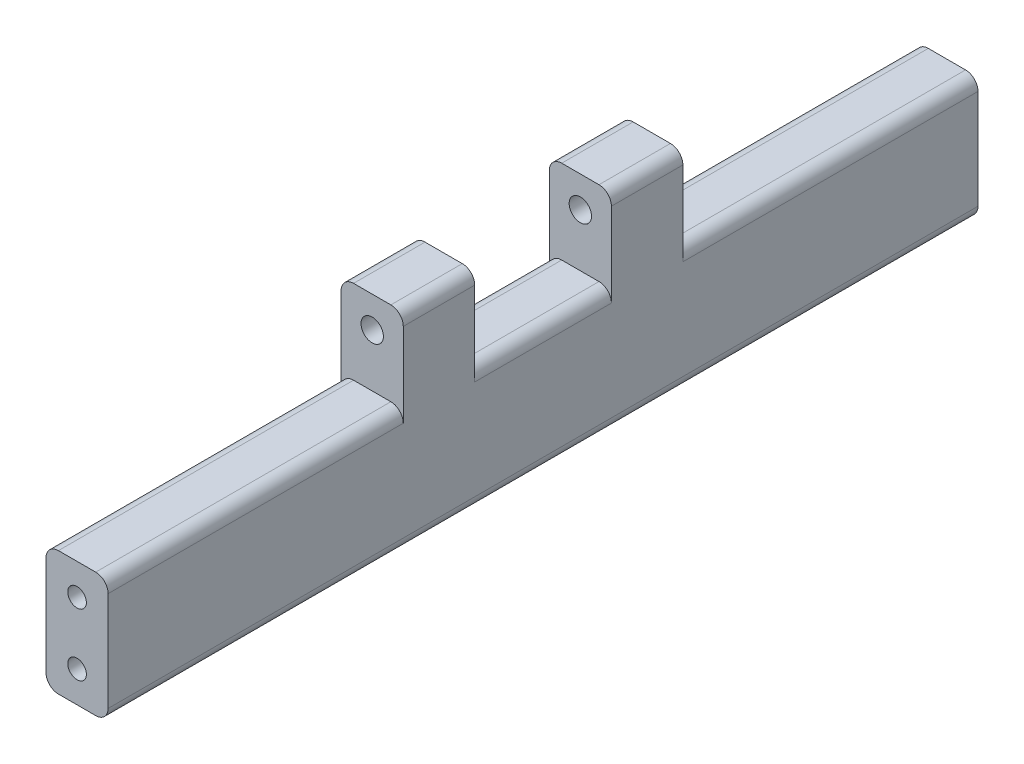
ISO-10303-21;
HEADER;
FILE_DESCRIPTION(('STEP AP214'),'2;1');
FILE_NAME('part.step','',(''),(''),'','','');
FILE_SCHEMA(('AUTOMOTIVE_DESIGN { 1 0 10303 214 1 1 1 1 }'));
ENDSEC;
DATA;
#1=APPLICATION_CONTEXT('core data for automotive mechanical design processes');
#2=APPLICATION_PROTOCOL_DEFINITION('international standard','automotive_design',2000,#1);
#3=PRODUCT_CONTEXT('',#1,'mechanical');
#4=PRODUCT('Part','Part','',(#3));
#5=PRODUCT_RELATED_PRODUCT_CATEGORY('part','',(#4));
#6=PRODUCT_DEFINITION_FORMATION('','',#4);
#7=PRODUCT_DEFINITION_CONTEXT('part definition',#1,'design');
#8=PRODUCT_DEFINITION('design','',#6,#7);
#9=PRODUCT_DEFINITION_SHAPE('','',#8);
#10=(LENGTH_UNIT() NAMED_UNIT(*) SI_UNIT(.MILLI.,.METRE.));
#11=(NAMED_UNIT(*) PLANE_ANGLE_UNIT() SI_UNIT($,.RADIAN.));
#12=(NAMED_UNIT(*) SI_UNIT($,.STERADIAN.) SOLID_ANGLE_UNIT());
#13=UNCERTAINTY_MEASURE_WITH_UNIT(LENGTH_MEASURE(1.E-05),#10,'distance_accuracy_value','');
#14=(GEOMETRIC_REPRESENTATION_CONTEXT(3) GLOBAL_UNCERTAINTY_ASSIGNED_CONTEXT((#13)) GLOBAL_UNIT_ASSIGNED_CONTEXT((#10,
#11,#12)) REPRESENTATION_CONTEXT('',''));
#15=CARTESIAN_POINT('',(0.,0.,0.));
#16=DIRECTION('',(0.,0.,1.));
#17=DIRECTION('',(1.,0.,0.));
#18=AXIS2_PLACEMENT_3D('',#15,#16,#17);
#19=CARTESIAN_POINT('',(0.,0.,-88.8999999999999));
#20=DIRECTION('',(-1.,0.,0.));
#21=DIRECTION('',(0.,0.,1.));
#22=AXIS2_PLACEMENT_3D('',#19,#20,#21);
#23=PLANE('',#22);
#24=DIRECTION('',(0.,1.,0.));
#25=VECTOR('',#24,1.);
#26=CARTESIAN_POINT('',(0.,29.845,-28.575));
#27=LINE('',#26,#25);
#28=CARTESIAN_POINT('',(0.,10.16,-28.575));
#29=VERTEX_POINT('',#28);
#30=CARTESIAN_POINT('',(0.,27.305,-28.575));
#31=VERTEX_POINT('',#30);
#32=EDGE_CURVE('E479',#29,#31,#27,.T.);
#33=ORIENTED_EDGE('',*,*,#32,.T.);
#34=DIRECTION('',(0.,0.,-1.));
#35=VECTOR('',#34,1.);
#36=CARTESIAN_POINT('',(0.,27.305,-88.8999999999999));
#37=LINE('',#36,#35);
#38=CARTESIAN_POINT('',(0.,27.305,-13.97));
#39=VERTEX_POINT('',#38);
#40=EDGE_CURVE('E274',#31,#39,#37,.F.);
#41=ORIENTED_EDGE('',*,*,#40,.T.);
#42=DIRECTION('',(0.,1.,0.));
#43=VECTOR('',#42,1.);
#44=CARTESIAN_POINT('',(0.,29.845,-13.97));
#45=LINE('',#44,#43);
#46=CARTESIAN_POINT('',(0.,10.16,-13.97));
#47=VERTEX_POINT('',#46);
#48=EDGE_CURVE('E900',#47,#39,#45,.T.);
#49=ORIENTED_EDGE('',*,*,#48,.F.);
#50=DIRECTION('',(0.,0.,1.));
#51=VECTOR('',#50,1.);
#52=CARTESIAN_POINT('',(0.,10.16,-88.8999999999999));
#53=LINE('',#52,#51);
#54=CARTESIAN_POINT('',(0.,10.16,13.97));
#55=VERTEX_POINT('',#54);
#56=EDGE_CURVE('E266',#47,#55,#53,.T.);
#57=ORIENTED_EDGE('',*,*,#56,.T.);
#58=DIRECTION('',(0.,1.,0.));
#59=VECTOR('',#58,1.);
#60=CARTESIAN_POINT('',(0.,29.845,13.97));
#61=LINE('',#60,#59);
#62=CARTESIAN_POINT('',(0.,27.305,13.97));
#63=VERTEX_POINT('',#62);
#64=EDGE_CURVE('E583',#55,#63,#61,.T.);
#65=ORIENTED_EDGE('',*,*,#64,.T.);
#66=DIRECTION('',(0.,0.,-1.));
#67=VECTOR('',#66,1.);
#68=CARTESIAN_POINT('',(0.,27.305,-88.8999999999999));
#69=LINE('',#68,#67);
#70=CARTESIAN_POINT('',(0.,27.305,28.575));
#71=VERTEX_POINT('',#70);
#72=EDGE_CURVE('E263',#63,#71,#69,.F.);
#73=ORIENTED_EDGE('',*,*,#72,.T.);
#74=DIRECTION('',(0.,1.,0.));
#75=VECTOR('',#74,1.);
#76=CARTESIAN_POINT('',(0.,29.845,28.575));
#77=LINE('',#76,#75);
#78=CARTESIAN_POINT('',(0.,10.16,28.575));
#79=VERTEX_POINT('',#78);
#80=EDGE_CURVE('E387',#79,#71,#77,.T.);
#81=ORIENTED_EDGE('',*,*,#80,.F.);
#82=DIRECTION('',(0.,0.,1.));
#83=VECTOR('',#82,1.);
#84=CARTESIAN_POINT('',(0.,10.16,-88.8999999999999));
#85=LINE('',#84,#83);
#86=CARTESIAN_POINT('',(0.,10.16,88.8999999999999));
#87=VERTEX_POINT('',#86);
#88=EDGE_CURVE('E219',#79,#87,#85,.T.);
#89=ORIENTED_EDGE('',*,*,#88,.T.);
#90=DIRECTION('',(0.,-1.,0.));
#91=VECTOR('',#90,1.);
#92=CARTESIAN_POINT('',(0.,0.,88.8999999999999));
#93=LINE('',#92,#91);
#94=CARTESIAN_POINT('',(0.,-10.16,88.8999999999999));
#95=VERTEX_POINT('',#94);
#96=EDGE_CURVE('E408',#87,#95,#93,.T.);
#97=ORIENTED_EDGE('',*,*,#96,.T.);
#98=DIRECTION('',(0.,0.,1.));
#99=VECTOR('',#98,1.);
#100=CARTESIAN_POINT('',(0.,-10.16,-88.8999999999999));
#101=LINE('',#100,#99);
#102=CARTESIAN_POINT('',(0.,-10.16,-88.8999999999999));
#103=VERTEX_POINT('',#102);
#104=EDGE_CURVE('E260',#95,#103,#101,.F.);
#105=ORIENTED_EDGE('',*,*,#104,.T.);
#106=DIRECTION('',(0.,-1.,0.));
#107=VECTOR('',#106,1.);
#108=CARTESIAN_POINT('',(0.,0.,-88.8999999999999));
#109=LINE('',#108,#107);
#110=CARTESIAN_POINT('',(0.,10.16,-88.8999999999999));
#111=VERTEX_POINT('',#110);
#112=EDGE_CURVE('E419',#111,#103,#109,.T.);
#113=ORIENTED_EDGE('',*,*,#112,.F.);
#114=DIRECTION('',(0.,0.,1.));
#115=VECTOR('',#114,1.);
#116=CARTESIAN_POINT('',(0.,10.16,-88.8999999999999));
#117=LINE('',#116,#115);
#118=EDGE_CURVE('E270',#111,#29,#117,.T.);
#119=ORIENTED_EDGE('',*,*,#118,.T.);
#120=EDGE_LOOP('',(#33,#41,#49,#57,#65,#73,#81,#89,#97,#105,#113,#119));
#121=FACE_BOUND('',#120,.T.);
#122=ADVANCED_FACE('F44',(#121),#23,.F.);
#123=CARTESIAN_POINT('',(-12.7,0.,-88.8999999999999));
#124=DIRECTION('',(-1.,0.,0.));
#125=DIRECTION('',(0.,-1.,0.));
#126=AXIS2_PLACEMENT_3D('',#123,#124,#125);
#127=PLANE('',#126);
#128=DIRECTION('',(0.,-1.,0.));
#129=VECTOR('',#128,1.);
#130=CARTESIAN_POINT('',(-12.7,29.845,-13.97));
#131=LINE('',#130,#129);
#132=CARTESIAN_POINT('',(-12.7,27.305,-13.97));
#133=VERTEX_POINT('',#132);
#134=CARTESIAN_POINT('',(-12.7,10.16,-13.97));
#135=VERTEX_POINT('',#134);
#136=EDGE_CURVE('E211',#133,#135,#131,.T.);
#137=ORIENTED_EDGE('',*,*,#136,.F.);
#138=DIRECTION('',(0.,0.,-1.));
#139=VECTOR('',#138,1.);
#140=CARTESIAN_POINT('',(-12.7,27.305,-28.575));
#141=LINE('',#140,#139);
#142=CARTESIAN_POINT('',(-12.7,27.305,-28.575));
#143=VERTEX_POINT('',#142);
#144=EDGE_CURVE('E225',#133,#143,#141,.T.);
#145=ORIENTED_EDGE('',*,*,#144,.T.);
#146=DIRECTION('',(0.,-1.,0.));
#147=VECTOR('',#146,1.);
#148=CARTESIAN_POINT('',(-12.7,12.7,-28.575));
#149=LINE('',#148,#147);
#150=CARTESIAN_POINT('',(-12.7,10.16,-28.575));
#151=VERTEX_POINT('',#150);
#152=EDGE_CURVE('E388',#143,#151,#149,.T.);
#153=ORIENTED_EDGE('',*,*,#152,.T.);
#154=DIRECTION('',(0.,0.,1.));
#155=VECTOR('',#154,1.);
#156=CARTESIAN_POINT('',(-12.7,10.16,-88.8999999999999));
#157=LINE('',#156,#155);
#158=CARTESIAN_POINT('',(-12.7,10.16,-88.8999999999999));
#159=VERTEX_POINT('',#158);
#160=EDGE_CURVE('E238',#151,#159,#157,.F.);
#161=ORIENTED_EDGE('',*,*,#160,.T.);
#162=DIRECTION('',(0.,-1.,0.));
#163=VECTOR('',#162,1.);
#164=CARTESIAN_POINT('',(-12.7,0.,-88.8999999999999));
#165=LINE('',#164,#163);
#166=CARTESIAN_POINT('',(-12.7,-10.16,-88.8999999999999));
#167=VERTEX_POINT('',#166);
#168=EDGE_CURVE('E449',#159,#167,#165,.T.);
#169=ORIENTED_EDGE('',*,*,#168,.T.);
#170=DIRECTION('',(0.,0.,1.));
#171=VECTOR('',#170,1.);
#172=CARTESIAN_POINT('',(-12.7,-10.16,-88.8999999999999));
#173=LINE('',#172,#171);
#174=CARTESIAN_POINT('',(-12.7,-10.16,88.8999999999999));
#175=VERTEX_POINT('',#174);
#176=EDGE_CURVE('E400',#167,#175,#173,.T.);
#177=ORIENTED_EDGE('',*,*,#176,.T.);
#178=DIRECTION('',(0.,-1.,0.));
#179=VECTOR('',#178,1.);
#180=CARTESIAN_POINT('',(-12.7,0.,88.8999999999999));
#181=LINE('',#180,#179);
#182=CARTESIAN_POINT('',(-12.7,10.16,88.8999999999999));
#183=VERTEX_POINT('',#182);
#184=EDGE_CURVE('E395',#183,#175,#181,.T.);
#185=ORIENTED_EDGE('',*,*,#184,.F.);
#186=DIRECTION('',(0.,0.,1.));
#187=VECTOR('',#186,1.);
#188=CARTESIAN_POINT('',(-12.7,10.16,28.575));
#189=LINE('',#188,#187);
#190=CARTESIAN_POINT('',(-12.7,10.16,28.575));
#191=VERTEX_POINT('',#190);
#192=EDGE_CURVE('E391',#183,#191,#189,.F.);
#193=ORIENTED_EDGE('',*,*,#192,.T.);
#194=DIRECTION('',(0.,-1.,0.));
#195=VECTOR('',#194,1.);
#196=CARTESIAN_POINT('',(-12.7,12.7,28.575));
#197=LINE('',#196,#195);
#198=CARTESIAN_POINT('',(-12.7,27.305,28.575));
#199=VERTEX_POINT('',#198);
#200=EDGE_CURVE('E376',#199,#191,#197,.T.);
#201=ORIENTED_EDGE('',*,*,#200,.F.);
#202=DIRECTION('',(0.,0.,-1.));
#203=VECTOR('',#202,1.);
#204=CARTESIAN_POINT('',(-12.7,27.305,13.97));
#205=LINE('',#204,#203);
#206=CARTESIAN_POINT('',(-12.7,27.305,13.97));
#207=VERTEX_POINT('',#206);
#208=EDGE_CURVE('E434',#199,#207,#205,.T.);
#209=ORIENTED_EDGE('',*,*,#208,.T.);
#210=DIRECTION('',(0.,-1.,0.));
#211=VECTOR('',#210,1.);
#212=CARTESIAN_POINT('',(-12.7,29.845,13.97));
#213=LINE('',#212,#211);
#214=CARTESIAN_POINT('',(-12.7,10.16,13.97));
#215=VERTEX_POINT('',#214);
#216=EDGE_CURVE('E575',#207,#215,#213,.T.);
#217=ORIENTED_EDGE('',*,*,#216,.T.);
#218=DIRECTION('',(0.,0.,1.));
#219=VECTOR('',#218,1.);
#220=CARTESIAN_POINT('',(-12.7,10.16,-13.97));
#221=LINE('',#220,#219);
#222=EDGE_CURVE('E228',#215,#135,#221,.F.);
#223=ORIENTED_EDGE('',*,*,#222,.T.);
#224=EDGE_LOOP('',(#137,#145,#153,#161,#169,#177,#185,#193,#201,#209,#217,#223));
#225=FACE_BOUND('',#224,.T.);
#226=ADVANCED_FACE('F224',(#225),#127,.T.);
#227=CARTESIAN_POINT('',(-12.7,29.845,28.575));
#228=DIRECTION('',(0.,-1.,0.));
#229=DIRECTION('',(0.,0.,-1.));
#230=AXIS2_PLACEMENT_3D('',#227,#228,#229);
#231=PLANE('',#230);
#232=DIRECTION('',(-1.,0.,0.));
#233=VECTOR('',#232,1.);
#234=CARTESIAN_POINT('',(-12.7,29.845,-28.575));
#235=LINE('',#234,#233);
#236=CARTESIAN_POINT('',(-2.54,29.845,-28.575));
#237=VERTEX_POINT('',#236);
#238=CARTESIAN_POINT('',(-10.16,29.845,-28.575));
#239=VERTEX_POINT('',#238);
#240=EDGE_CURVE('E483',#237,#239,#235,.T.);
#241=ORIENTED_EDGE('',*,*,#240,.T.);
#242=DIRECTION('',(0.,0.,-1.));
#243=VECTOR('',#242,1.);
#244=CARTESIAN_POINT('',(-10.16,29.845,-13.97));
#245=LINE('',#244,#243);
#246=CARTESIAN_POINT('',(-10.16,29.845,-13.97));
#247=VERTEX_POINT('',#246);
#248=EDGE_CURVE('E252',#239,#247,#245,.F.);
#249=ORIENTED_EDGE('',*,*,#248,.T.);
#250=DIRECTION('',(-1.,0.,0.));
#251=VECTOR('',#250,1.);
#252=CARTESIAN_POINT('',(-12.7,29.845,-13.97));
#253=LINE('',#252,#251);
#254=CARTESIAN_POINT('',(-2.54,29.845,-13.97));
#255=VERTEX_POINT('',#254);
#256=EDGE_CURVE('E214',#255,#247,#253,.T.);
#257=ORIENTED_EDGE('',*,*,#256,.F.);
#258=DIRECTION('',(0.,0.,-1.));
#259=VECTOR('',#258,1.);
#260=CARTESIAN_POINT('',(-2.54,29.845,28.575));
#261=LINE('',#260,#259);
#262=EDGE_CURVE('E248',#255,#237,#261,.T.);
#263=ORIENTED_EDGE('',*,*,#262,.T.);
#264=EDGE_LOOP('',(#241,#249,#257,#263));
#265=FACE_BOUND('',#264,.T.);
#266=ADVANCED_FACE('F531',(#265),#231,.F.);
#267=CARTESIAN_POINT('',(-6.35000000000001,23.495,28.575));
#268=DIRECTION('',(0.,0.,-1.));
#269=DIRECTION('',(-1.,0.,0.));
#270=AXIS2_PLACEMENT_3D('',#267,#268,#269);
#271=CYLINDRICAL_SURFACE('',#270,2.286);
#272=CARTESIAN_POINT('',(-6.35000000000001,23.495,-28.575));
#273=DIRECTION('',(0.,0.,1.));
#274=DIRECTION('',(1.,0.,0.));
#275=AXIS2_PLACEMENT_3D('',#272,#273,#274);
#276=CIRCLE('',#275,2.286);
#277=CARTESIAN_POINT('',(-4.06400000000001,23.495,-28.575));
#278=VERTEX_POINT('',#277);
#279=EDGE_CURVE('E428',#278,#278,#276,.T.);
#280=ORIENTED_EDGE('',*,*,#279,.F.);
#281=EDGE_LOOP('',(#280));
#282=FACE_BOUND('',#281,.T.);
#283=CARTESIAN_POINT('',(-6.35000000000001,23.495,-13.97));
#284=DIRECTION('',(0.,0.,1.));
#285=DIRECTION('',(1.,0.,0.));
#286=AXIS2_PLACEMENT_3D('',#283,#284,#285);
#287=CIRCLE('',#286,2.286);
#288=CARTESIAN_POINT('',(-4.06400000000001,23.495,-13.97));
#289=VERTEX_POINT('',#288);
#290=EDGE_CURVE('E424',#289,#289,#287,.T.);
#291=ORIENTED_EDGE('',*,*,#290,.T.);
#292=EDGE_LOOP('',(#291));
#293=FACE_BOUND('',#292,.T.);
#294=ADVANCED_FACE('F601',(#282,#293),#271,.F.);
#295=CARTESIAN_POINT('',(0.,12.7,-88.8999999999999));
#296=DIRECTION('',(0.,-1.,0.));
#297=DIRECTION('',(0.,0.,-1.));
#298=AXIS2_PLACEMENT_3D('',#295,#296,#297);
#299=PLANE('',#298);
#300=DIRECTION('',(1.,0.,0.));
#301=VECTOR('',#300,1.);
#302=CARTESIAN_POINT('',(0.,12.7,28.575));
#303=LINE('',#302,#301);
#304=CARTESIAN_POINT('',(-10.16,12.7,28.575));
#305=VERTEX_POINT('',#304);
#306=CARTESIAN_POINT('',(-2.54,12.7,28.575));
#307=VERTEX_POINT('',#306);
#308=EDGE_CURVE('E373',#305,#307,#303,.T.);
#309=ORIENTED_EDGE('',*,*,#308,.F.);
#310=DIRECTION('',(0.,0.,1.));
#311=VECTOR('',#310,1.);
#312=CARTESIAN_POINT('',(-10.16,12.7,88.8999999999999));
#313=LINE('',#312,#311);
#314=CARTESIAN_POINT('',(-10.16,12.7,88.8999999999999));
#315=VERTEX_POINT('',#314);
#316=EDGE_CURVE('E325',#305,#315,#313,.T.);
#317=ORIENTED_EDGE('',*,*,#316,.T.);
#318=DIRECTION('',(1.,0.,0.));
#319=VECTOR('',#318,1.);
#320=CARTESIAN_POINT('',(0.,12.7,88.8999999999999));
#321=LINE('',#320,#319);
#322=CARTESIAN_POINT('',(-2.54,12.7,88.8999999999999));
#323=VERTEX_POINT('',#322);
#324=EDGE_CURVE('E396',#315,#323,#321,.T.);
#325=ORIENTED_EDGE('',*,*,#324,.T.);
#326=DIRECTION('',(0.,0.,1.));
#327=VECTOR('',#326,1.);
#328=CARTESIAN_POINT('',(-2.54,12.7,-88.8999999999999));
#329=LINE('',#328,#327);
#330=EDGE_CURVE('E322',#323,#307,#329,.F.);
#331=ORIENTED_EDGE('',*,*,#330,.T.);
#332=EDGE_LOOP('',(#309,#317,#325,#331));
#333=FACE_BOUND('',#332,.T.);
#334=ADVANCED_FACE('F382',(#333),#299,.F.);
#335=CARTESIAN_POINT('',(0.,-12.7,-88.8999999999999));
#336=DIRECTION('',(0.,-1.,0.));
#337=DIRECTION('',(0.,0.,-1.));
#338=AXIS2_PLACEMENT_3D('',#335,#336,#337);
#339=PLANE('',#338);
#340=DIRECTION('',(1.,0.,0.));
#341=VECTOR('',#340,1.);
#342=CARTESIAN_POINT('',(0.,-12.7,88.8999999999999));
#343=LINE('',#342,#341);
#344=CARTESIAN_POINT('',(-10.16,-12.7,88.8999999999999));
#345=VERTEX_POINT('',#344);
#346=CARTESIAN_POINT('',(-2.54,-12.7,88.8999999999999));
#347=VERTEX_POINT('',#346);
#348=EDGE_CURVE('E402',#345,#347,#343,.T.);
#349=ORIENTED_EDGE('',*,*,#348,.F.);
#350=DIRECTION('',(0.,0.,1.));
#351=VECTOR('',#350,1.);
#352=CARTESIAN_POINT('',(-10.16,-12.7,-88.8999999999999));
#353=LINE('',#352,#351);
#354=CARTESIAN_POINT('',(-10.16,-12.7,-88.8999999999999));
#355=VERTEX_POINT('',#354);
#356=EDGE_CURVE('E342',#345,#355,#353,.F.);
#357=ORIENTED_EDGE('',*,*,#356,.T.);
#358=DIRECTION('',(1.,0.,0.));
#359=VECTOR('',#358,1.);
#360=CARTESIAN_POINT('',(0.,-12.7,-88.8999999999999));
#361=LINE('',#360,#359);
#362=CARTESIAN_POINT('',(-2.54,-12.7,-88.8999999999999));
#363=VERTEX_POINT('',#362);
#364=EDGE_CURVE('E445',#355,#363,#361,.T.);
#365=ORIENTED_EDGE('',*,*,#364,.T.);
#366=DIRECTION('',(0.,0.,1.));
#367=VECTOR('',#366,1.);
#368=CARTESIAN_POINT('',(-2.54,-12.7,88.8999999999999));
#369=LINE('',#368,#367);
#370=EDGE_CURVE('E339',#363,#347,#369,.T.);
#371=ORIENTED_EDGE('',*,*,#370,.T.);
#372=EDGE_LOOP('',(#349,#357,#365,#371));
#373=FACE_BOUND('',#372,.T.);
#374=ADVANCED_FACE('F514',(#373),#339,.T.);
#375=CARTESIAN_POINT('',(-6.35000000000001,-6.35,-88.8999999999999));
#376=DIRECTION('',(0.,0.,1.));
#377=DIRECTION('',(1.,0.,0.));
#378=AXIS2_PLACEMENT_3D('',#375,#376,#377);
#379=CYLINDRICAL_SURFACE('',#378,1.905);
#380=CARTESIAN_POINT('',(-6.35000000000001,-6.35,-88.8999999999999));
#381=DIRECTION('',(0.,0.,1.));
#382=DIRECTION('',(1.,0.,0.));
#383=AXIS2_PLACEMENT_3D('',#380,#381,#382);
#384=CIRCLE('',#383,1.905);
#385=CARTESIAN_POINT('',(-4.44500000000001,-6.35,-88.8999999999999));
#386=VERTEX_POINT('',#385);
#387=EDGE_CURVE('E441',#386,#386,#384,.F.);
#388=ORIENTED_EDGE('',*,*,#387,.T.);
#389=EDGE_LOOP('',(#388));
#390=FACE_BOUND('',#389,.T.);
#391=CARTESIAN_POINT('',(-6.35000000000001,-6.35,88.8999999999999));
#392=DIRECTION('',(0.,0.,1.));
#393=DIRECTION('',(1.,0.,0.));
#394=AXIS2_PLACEMENT_3D('',#391,#392,#393);
#395=CIRCLE('',#394,1.905);
#396=CARTESIAN_POINT('',(-4.44500000000001,-6.35,88.8999999999999));
#397=VERTEX_POINT('',#396);
#398=EDGE_CURVE('E406',#397,#397,#395,.F.);
#399=ORIENTED_EDGE('',*,*,#398,.F.);
#400=EDGE_LOOP('',(#399));
#401=FACE_BOUND('',#400,.T.);
#402=ADVANCED_FACE('F636',(#390,#401),#379,.F.);
#403=DIRECTION('',(1.,0.,0.));
#404=VECTOR('',#403,1.);
#405=CARTESIAN_POINT('',(0.,12.7,-88.8999999999999));
#406=LINE('',#405,#404);
#407=CARTESIAN_POINT('',(-10.16,12.7,-88.8999999999999));
#408=VERTEX_POINT('',#407);
#409=CARTESIAN_POINT('',(-2.54,12.7,-88.8999999999999));
#410=VERTEX_POINT('',#409);
#411=EDGE_CURVE('E452',#408,#410,#406,.T.);
#412=ORIENTED_EDGE('',*,*,#411,.F.);
#413=DIRECTION('',(0.,0.,1.));
#414=VECTOR('',#413,1.);
#415=CARTESIAN_POINT('',(-10.16,12.7,-28.575));
#416=LINE('',#415,#414);
#417=CARTESIAN_POINT('',(-10.16,12.7,-28.575));
#418=VERTEX_POINT('',#417);
#419=EDGE_CURVE('E280',#408,#418,#416,.T.);
#420=ORIENTED_EDGE('',*,*,#419,.T.);
#421=DIRECTION('',(1.,0.,0.));
#422=VECTOR('',#421,1.);
#423=CARTESIAN_POINT('',(0.,12.7,-28.575));
#424=LINE('',#423,#422);
#425=CARTESIAN_POINT('',(-2.54,12.7,-28.575));
#426=VERTEX_POINT('',#425);
#427=EDGE_CURVE('E475',#418,#426,#424,.T.);
#428=ORIENTED_EDGE('',*,*,#427,.T.);
#429=DIRECTION('',(0.,0.,1.));
#430=VECTOR('',#429,1.);
#431=CARTESIAN_POINT('',(-2.54,12.7,-88.8999999999999));
#432=LINE('',#431,#430);
#433=EDGE_CURVE('E277',#426,#410,#432,.F.);
#434=ORIENTED_EDGE('',*,*,#433,.T.);
#435=EDGE_LOOP('',(#412,#420,#428,#434));
#436=FACE_BOUND('',#435,.T.);
#437=ADVANCED_FACE('F504',(#436),#299,.F.);
#438=CARTESIAN_POINT('',(-6.35000000000001,6.35,-88.8999999999999));
#439=DIRECTION('',(0.,0.,1.));
#440=DIRECTION('',(1.,0.,0.));
#441=AXIS2_PLACEMENT_3D('',#438,#439,#440);
#442=CYLINDRICAL_SURFACE('',#441,1.905);
#443=CARTESIAN_POINT('',(-6.35000000000001,6.35,-88.8999999999999));
#444=DIRECTION('',(0.,0.,1.));
#445=DIRECTION('',(1.,0.,0.));
#446=AXIS2_PLACEMENT_3D('',#443,#444,#445);
#447=CIRCLE('',#446,1.905);
#448=CARTESIAN_POINT('',(-4.44500000000001,6.35,-88.8999999999999));
#449=VERTEX_POINT('',#448);
#450=EDGE_CURVE('E431',#449,#449,#447,.T.);
#451=ORIENTED_EDGE('',*,*,#450,.F.);
#452=EDGE_LOOP('',(#451));
#453=FACE_BOUND('',#452,.T.);
#454=CARTESIAN_POINT('',(-6.35000000000001,6.35,88.8999999999999));
#455=DIRECTION('',(0.,0.,1.));
#456=DIRECTION('',(1.,0.,0.));
#457=AXIS2_PLACEMENT_3D('',#454,#455,#456);
#458=CIRCLE('',#457,1.905);
#459=CARTESIAN_POINT('',(-4.44500000000001,6.35,88.8999999999999));
#460=VERTEX_POINT('',#459);
#461=EDGE_CURVE('E415',#460,#460,#458,.T.);
#462=ORIENTED_EDGE('',*,*,#461,.T.);
#463=EDGE_LOOP('',(#462));
#464=FACE_BOUND('',#463,.T.);
#465=ADVANCED_FACE('F630',(#453,#464),#442,.F.);
#466=CARTESIAN_POINT('',(0.,0.,-88.8999999999999));
#467=DIRECTION('',(0.,0.,1.));
#468=DIRECTION('',(1.,0.,0.));
#469=AXIS2_PLACEMENT_3D('',#466,#467,#468);
#470=PLANE('',#469);
#471=ORIENTED_EDGE('',*,*,#168,.F.);
#472=CARTESIAN_POINT('',(-10.16,10.16,-88.8999999999999));
#473=DIRECTION('',(0.,0.,1.));
#474=DIRECTION('',(1.,0.,0.));
#475=AXIS2_PLACEMENT_3D('',#472,#473,#474);
#476=CIRCLE('',#475,2.54);
#477=EDGE_CURVE('E293',#159,#408,#476,.F.);
#478=ORIENTED_EDGE('',*,*,#477,.T.);
#479=ORIENTED_EDGE('',*,*,#411,.T.);
#480=CARTESIAN_POINT('',(-2.54,10.16,-88.8999999999999));
#481=DIRECTION('',(0.,0.,1.));
#482=DIRECTION('',(1.,0.,0.));
#483=AXIS2_PLACEMENT_3D('',#480,#481,#482);
#484=CIRCLE('',#483,2.54);
#485=EDGE_CURVE('E290',#410,#111,#484,.F.);
#486=ORIENTED_EDGE('',*,*,#485,.T.);
#487=ORIENTED_EDGE('',*,*,#112,.T.);
#488=CARTESIAN_POINT('',(-2.54,-10.16,-88.8999999999999));
#489=DIRECTION('',(0.,0.,1.));
#490=DIRECTION('',(1.,0.,0.));
#491=AXIS2_PLACEMENT_3D('',#488,#489,#490);
#492=CIRCLE('',#491,2.54);
#493=EDGE_CURVE('E284',#103,#363,#492,.F.);
#494=ORIENTED_EDGE('',*,*,#493,.T.);
#495=ORIENTED_EDGE('',*,*,#364,.F.);
#496=CARTESIAN_POINT('',(-10.16,-10.16,-88.8999999999999));
#497=DIRECTION('',(0.,0.,1.));
#498=DIRECTION('',(1.,0.,0.));
#499=AXIS2_PLACEMENT_3D('',#496,#497,#498);
#500=CIRCLE('',#499,2.54);
#501=EDGE_CURVE('E287',#355,#167,#500,.F.);
#502=ORIENTED_EDGE('',*,*,#501,.T.);
#503=EDGE_LOOP('',(#471,#478,#479,#486,#487,#494,#495,#502));
#504=FACE_BOUND('',#503,.T.);
#505=ORIENTED_EDGE('',*,*,#387,.F.);
#506=EDGE_LOOP('',(#505));
#507=FACE_BOUND('',#506,.T.);
#508=ORIENTED_EDGE('',*,*,#450,.T.);
#509=EDGE_LOOP('',(#508));
#510=FACE_BOUND('',#509,.T.);
#511=ADVANCED_FACE('F500',(#504,#507,#510),#470,.F.);
#512=CARTESIAN_POINT('',(0.,0.,88.8999999999999));
#513=DIRECTION('',(0.,0.,1.));
#514=DIRECTION('',(1.,0.,0.));
#515=AXIS2_PLACEMENT_3D('',#512,#513,#514);
#516=PLANE('',#515);
#517=ORIENTED_EDGE('',*,*,#324,.F.);
#518=CARTESIAN_POINT('',(-10.16,10.16,88.8999999999999));
#519=DIRECTION('',(0.,0.,1.));
#520=DIRECTION('',(1.,0.,0.));
#521=AXIS2_PLACEMENT_3D('',#518,#519,#520);
#522=CIRCLE('',#521,2.54);
#523=EDGE_CURVE('E336',#315,#183,#522,.T.);
#524=ORIENTED_EDGE('',*,*,#523,.T.);
#525=ORIENTED_EDGE('',*,*,#184,.T.);
#526=CARTESIAN_POINT('',(-10.16,-10.16,88.8999999999999));
#527=DIRECTION('',(0.,0.,1.));
#528=DIRECTION('',(1.,0.,0.));
#529=AXIS2_PLACEMENT_3D('',#526,#527,#528);
#530=CIRCLE('',#529,2.54);
#531=EDGE_CURVE('E68',#175,#345,#530,.T.);
#532=ORIENTED_EDGE('',*,*,#531,.T.);
#533=ORIENTED_EDGE('',*,*,#348,.T.);
#534=CARTESIAN_POINT('',(-2.54,-10.16,88.8999999999999));
#535=DIRECTION('',(0.,0.,1.));
#536=DIRECTION('',(1.,0.,0.));
#537=AXIS2_PLACEMENT_3D('',#534,#535,#536);
#538=CIRCLE('',#537,2.54);
#539=EDGE_CURVE('E60',#347,#95,#538,.T.);
#540=ORIENTED_EDGE('',*,*,#539,.T.);
#541=ORIENTED_EDGE('',*,*,#96,.F.);
#542=CARTESIAN_POINT('',(-2.54,10.16,88.8999999999999));
#543=DIRECTION('',(0.,0.,1.));
#544=DIRECTION('',(1.,0.,0.));
#545=AXIS2_PLACEMENT_3D('',#542,#543,#544);
#546=CIRCLE('',#545,2.54);
#547=EDGE_CURVE('E329',#87,#323,#546,.T.);
#548=ORIENTED_EDGE('',*,*,#547,.T.);
#549=EDGE_LOOP('',(#517,#524,#525,#532,#533,#540,#541,#548));
#550=FACE_BOUND('',#549,.T.);
#551=ORIENTED_EDGE('',*,*,#398,.T.);
#552=EDGE_LOOP('',(#551));
#553=FACE_BOUND('',#552,.T.);
#554=ORIENTED_EDGE('',*,*,#461,.F.);
#555=EDGE_LOOP('',(#554));
#556=FACE_BOUND('',#555,.T.);
#557=ADVANCED_FACE('F393',(#550,#553,#556),#516,.T.);
#558=CARTESIAN_POINT('',(0.,0.,28.575));
#559=DIRECTION('',(0.,0.,-1.));
#560=DIRECTION('',(-1.,0.,0.));
#561=AXIS2_PLACEMENT_3D('',#558,#559,#560);
#562=PLANE('',#561);
#563=DIRECTION('',(-1.,0.,0.));
#564=VECTOR('',#563,1.);
#565=CARTESIAN_POINT('',(-12.7,29.845,28.575));
#566=LINE('',#565,#564);
#567=CARTESIAN_POINT('',(-2.54,29.845,28.575));
#568=VERTEX_POINT('',#567);
#569=CARTESIAN_POINT('',(-10.16,29.845,28.575));
#570=VERTEX_POINT('',#569);
#571=EDGE_CURVE('E469',#568,#570,#566,.T.);
#572=ORIENTED_EDGE('',*,*,#571,.T.);
#573=CARTESIAN_POINT('',(-10.16,27.305,28.575));
#574=DIRECTION('',(0.,0.,-1.));
#575=DIRECTION('',(-1.,0.,0.));
#576=AXIS2_PLACEMENT_3D('',#573,#574,#575);
#577=CIRCLE('',#576,2.54);
#578=EDGE_CURVE('E319',#570,#199,#577,.F.);
#579=ORIENTED_EDGE('',*,*,#578,.T.);
#580=ORIENTED_EDGE('',*,*,#200,.T.);
#581=CARTESIAN_POINT('',(-10.16,10.16,28.575));
#582=DIRECTION('',(0.,0.,-1.));
#583=DIRECTION('',(-1.,0.,0.));
#584=AXIS2_PLACEMENT_3D('',#581,#582,#583);
#585=CIRCLE('',#584,2.54);
#586=EDGE_CURVE('E53',#191,#305,#585,.T.);
#587=ORIENTED_EDGE('',*,*,#586,.T.);
#588=ORIENTED_EDGE('',*,*,#308,.T.);
#589=CARTESIAN_POINT('',(-2.54,10.16,28.575));
#590=DIRECTION('',(0.,0.,-1.));
#591=DIRECTION('',(-1.,0.,0.));
#592=AXIS2_PLACEMENT_3D('',#589,#590,#591);
#593=CIRCLE('',#592,2.54);
#594=EDGE_CURVE('E11',#307,#79,#593,.T.);
#595=ORIENTED_EDGE('',*,*,#594,.T.);
#596=ORIENTED_EDGE('',*,*,#80,.T.);
#597=CARTESIAN_POINT('',(-2.54,27.305,28.575));
#598=DIRECTION('',(0.,0.,-1.));
#599=DIRECTION('',(-1.,0.,0.));
#600=AXIS2_PLACEMENT_3D('',#597,#598,#599);
#601=CIRCLE('',#600,2.54);
#602=EDGE_CURVE('E316',#71,#568,#601,.F.);
#603=ORIENTED_EDGE('',*,*,#602,.T.);
#604=EDGE_LOOP('',(#572,#579,#580,#587,#588,#595,#596,#603));
#605=FACE_BOUND('',#604,.T.);
#606=CARTESIAN_POINT('',(-6.35000000000001,23.495,28.575));
#607=DIRECTION('',(0.,0.,1.));
#608=DIRECTION('',(1.,0.,0.));
#609=AXIS2_PLACEMENT_3D('',#606,#607,#608);
#610=CIRCLE('',#609,2.286);
#611=CARTESIAN_POINT('',(-4.06400000000001,23.495,28.575));
#612=VERTEX_POINT('',#611);
#613=EDGE_CURVE('E480',#612,#612,#610,.T.);
#614=ORIENTED_EDGE('',*,*,#613,.F.);
#615=EDGE_LOOP('',(#614));
#616=FACE_BOUND('',#615,.T.);
#617=ADVANCED_FACE('F371',(#605,#616),#562,.F.);
#618=CARTESIAN_POINT('',(0.,0.,-28.575));
#619=DIRECTION('',(0.,0.,-1.));
#620=DIRECTION('',(-1.,0.,0.));
#621=AXIS2_PLACEMENT_3D('',#618,#619,#620);
#622=PLANE('',#621);
#623=ORIENTED_EDGE('',*,*,#152,.F.);
#624=CARTESIAN_POINT('',(-10.16,27.305,-28.575));
#625=DIRECTION('',(0.,0.,-1.));
#626=DIRECTION('',(-1.,0.,0.));
#627=AXIS2_PLACEMENT_3D('',#624,#625,#626);
#628=CIRCLE('',#627,2.54);
#629=EDGE_CURVE('E235',#143,#239,#628,.T.);
#630=ORIENTED_EDGE('',*,*,#629,.T.);
#631=ORIENTED_EDGE('',*,*,#240,.F.);
#632=CARTESIAN_POINT('',(-2.54,27.305,-28.575));
#633=DIRECTION('',(0.,0.,-1.));
#634=DIRECTION('',(-1.,0.,0.));
#635=AXIS2_PLACEMENT_3D('',#632,#633,#634);
#636=CIRCLE('',#635,2.54);
#637=EDGE_CURVE('E237',#237,#31,#636,.T.);
#638=ORIENTED_EDGE('',*,*,#637,.T.);
#639=ORIENTED_EDGE('',*,*,#32,.F.);
#640=CARTESIAN_POINT('',(-2.54,10.16,-28.575));
#641=DIRECTION('',(0.,0.,-1.));
#642=DIRECTION('',(-1.,0.,0.));
#643=AXIS2_PLACEMENT_3D('',#640,#641,#642);
#644=CIRCLE('',#643,2.54);
#645=EDGE_CURVE('E349',#29,#426,#644,.F.);
#646=ORIENTED_EDGE('',*,*,#645,.T.);
#647=ORIENTED_EDGE('',*,*,#427,.F.);
#648=CARTESIAN_POINT('',(-10.16,10.16,-28.575));
#649=DIRECTION('',(0.,0.,-1.));
#650=DIRECTION('',(-1.,0.,0.));
#651=AXIS2_PLACEMENT_3D('',#648,#649,#650);
#652=CIRCLE('',#651,2.54);
#653=EDGE_CURVE('E345',#418,#151,#652,.F.);
#654=ORIENTED_EDGE('',*,*,#653,.T.);
#655=EDGE_LOOP('',(#623,#630,#631,#638,#639,#646,#647,#654));
#656=FACE_BOUND('',#655,.T.);
#657=ORIENTED_EDGE('',*,*,#279,.T.);
#658=EDGE_LOOP('',(#657));
#659=FACE_BOUND('',#658,.T.);
#660=ADVANCED_FACE('F493',(#656,#659),#622,.T.);
#661=DIRECTION('',(-1.,0.,0.));
#662=VECTOR('',#661,1.);
#663=CARTESIAN_POINT('',(-12.7,29.845,13.97));
#664=LINE('',#663,#662);
#665=CARTESIAN_POINT('',(-2.54,29.845,13.97));
#666=VERTEX_POINT('',#665);
#667=CARTESIAN_POINT('',(-10.16,29.845,13.97));
#668=VERTEX_POINT('',#667);
#669=EDGE_CURVE('E232',#666,#668,#664,.T.);
#670=ORIENTED_EDGE('',*,*,#669,.T.);
#671=DIRECTION('',(0.,0.,-1.));
#672=VECTOR('',#671,1.);
#673=CARTESIAN_POINT('',(-10.16,29.845,28.575));
#674=LINE('',#673,#672);
#675=EDGE_CURVE('E313',#668,#570,#674,.F.);
#676=ORIENTED_EDGE('',*,*,#675,.T.);
#677=ORIENTED_EDGE('',*,*,#571,.F.);
#678=DIRECTION('',(0.,0.,-1.));
#679=VECTOR('',#678,1.);
#680=CARTESIAN_POINT('',(-2.54,29.845,28.575));
#681=LINE('',#680,#679);
#682=EDGE_CURVE('E309',#568,#666,#681,.T.);
#683=ORIENTED_EDGE('',*,*,#682,.T.);
#684=EDGE_LOOP('',(#670,#676,#677,#683));
#685=FACE_BOUND('',#684,.T.);
#686=ADVANCED_FACE('F570',(#685),#231,.F.);
#687=CARTESIAN_POINT('',(-6.35000000000001,23.495,13.97));
#688=DIRECTION('',(0.,0.,1.));
#689=DIRECTION('',(1.,0.,0.));
#690=AXIS2_PLACEMENT_3D('',#687,#688,#689);
#691=CIRCLE('',#690,2.286);
#692=CARTESIAN_POINT('',(-4.06400000000001,23.495,13.97));
#693=VERTEX_POINT('',#692);
#694=EDGE_CURVE('E420',#693,#693,#691,.T.);
#695=ORIENTED_EDGE('',*,*,#694,.F.);
#696=EDGE_LOOP('',(#695));
#697=FACE_BOUND('',#696,.T.);
#698=ORIENTED_EDGE('',*,*,#613,.T.);
#699=EDGE_LOOP('',(#698));
#700=FACE_BOUND('',#699,.T.);
#701=ADVANCED_FACE('F605',(#697,#700),#271,.F.);
#702=CARTESIAN_POINT('',(-12.7,12.7,-13.97));
#703=DIRECTION('',(0.,-1.,0.));
#704=DIRECTION('',(0.,0.,-1.));
#705=AXIS2_PLACEMENT_3D('',#702,#703,#704);
#706=PLANE('',#705);
#707=DIRECTION('',(1.,0.,0.));
#708=VECTOR('',#707,1.);
#709=CARTESIAN_POINT('',(-12.7,12.7,-13.97));
#710=LINE('',#709,#708);
#711=CARTESIAN_POINT('',(-10.16,12.7,-13.97));
#712=VERTEX_POINT('',#711);
#713=CARTESIAN_POINT('',(-2.54,12.7,-13.97));
#714=VERTEX_POINT('',#713);
#715=EDGE_CURVE('E231',#712,#714,#710,.T.);
#716=ORIENTED_EDGE('',*,*,#715,.F.);
#717=DIRECTION('',(0.,0.,1.));
#718=VECTOR('',#717,1.);
#719=CARTESIAN_POINT('',(-10.16,12.7,13.97));
#720=LINE('',#719,#718);
#721=CARTESIAN_POINT('',(-10.16,12.7,13.97));
#722=VERTEX_POINT('',#721);
#723=EDGE_CURVE('E299',#712,#722,#720,.T.);
#724=ORIENTED_EDGE('',*,*,#723,.T.);
#725=DIRECTION('',(1.,0.,0.));
#726=VECTOR('',#725,1.);
#727=CARTESIAN_POINT('',(-12.7,12.7,13.97));
#728=LINE('',#727,#726);
#729=CARTESIAN_POINT('',(-2.54,12.7,13.97));
#730=VERTEX_POINT('',#729);
#731=EDGE_CURVE('E579',#722,#730,#728,.T.);
#732=ORIENTED_EDGE('',*,*,#731,.T.);
#733=DIRECTION('',(0.,0.,1.));
#734=VECTOR('',#733,1.);
#735=CARTESIAN_POINT('',(-2.54,12.7,-13.97));
#736=LINE('',#735,#734);
#737=EDGE_CURVE('E296',#730,#714,#736,.F.);
#738=ORIENTED_EDGE('',*,*,#737,.T.);
#739=EDGE_LOOP('',(#716,#724,#732,#738));
#740=FACE_BOUND('',#739,.T.);
#741=ADVANCED_FACE('F609',(#740),#706,.F.);
#742=CARTESIAN_POINT('',(0.,0.,-13.97));
#743=DIRECTION('',(0.,0.,1.));
#744=DIRECTION('',(1.,0.,0.));
#745=AXIS2_PLACEMENT_3D('',#742,#743,#744);
#746=PLANE('',#745);
#747=ORIENTED_EDGE('',*,*,#290,.F.);
#748=EDGE_LOOP('',(#747));
#749=FACE_BOUND('',#748,.T.);
#750=ORIENTED_EDGE('',*,*,#256,.T.);
#751=CARTESIAN_POINT('',(-10.16,27.305,-13.97));
#752=DIRECTION('',(0.,0.,1.));
#753=DIRECTION('',(1.,0.,0.));
#754=AXIS2_PLACEMENT_3D('',#751,#752,#753);
#755=CIRCLE('',#754,2.54);
#756=EDGE_CURVE('E208',#247,#133,#755,.T.);
#757=ORIENTED_EDGE('',*,*,#756,.T.);
#758=ORIENTED_EDGE('',*,*,#136,.T.);
#759=CARTESIAN_POINT('',(-10.16,10.16,-13.97));
#760=DIRECTION('',(0.,0.,1.));
#761=DIRECTION('',(1.,0.,0.));
#762=AXIS2_PLACEMENT_3D('',#759,#760,#761);
#763=CIRCLE('',#762,2.54);
#764=EDGE_CURVE('E356',#135,#712,#763,.F.);
#765=ORIENTED_EDGE('',*,*,#764,.T.);
#766=ORIENTED_EDGE('',*,*,#715,.T.);
#767=CARTESIAN_POINT('',(-2.54,10.16,-13.97));
#768=DIRECTION('',(0.,0.,1.));
#769=DIRECTION('',(1.,0.,0.));
#770=AXIS2_PLACEMENT_3D('',#767,#768,#769);
#771=CIRCLE('',#770,2.54);
#772=EDGE_CURVE('E362',#714,#47,#771,.F.);
#773=ORIENTED_EDGE('',*,*,#772,.T.);
#774=ORIENTED_EDGE('',*,*,#48,.T.);
#775=CARTESIAN_POINT('',(-2.54,27.305,-13.97));
#776=DIRECTION('',(0.,0.,1.));
#777=DIRECTION('',(1.,0.,0.));
#778=AXIS2_PLACEMENT_3D('',#775,#776,#777);
#779=CIRCLE('',#778,2.54);
#780=EDGE_CURVE('E220',#39,#255,#779,.T.);
#781=ORIENTED_EDGE('',*,*,#780,.T.);
#782=EDGE_LOOP('',(#750,#757,#758,#765,#766,#773,#774,#781));
#783=FACE_BOUND('',#782,.T.);
#784=ADVANCED_FACE('F210',(#749,#783),#746,.T.);
#785=CARTESIAN_POINT('',(0.,0.,13.97));
#786=DIRECTION('',(0.,0.,1.));
#787=DIRECTION('',(1.,0.,0.));
#788=AXIS2_PLACEMENT_3D('',#785,#786,#787);
#789=PLANE('',#788);
#790=ORIENTED_EDGE('',*,*,#694,.T.);
#791=EDGE_LOOP('',(#790));
#792=FACE_BOUND('',#791,.T.);
#793=ORIENTED_EDGE('',*,*,#216,.F.);
#794=CARTESIAN_POINT('',(-10.16,27.305,13.97));
#795=DIRECTION('',(0.,0.,1.));
#796=DIRECTION('',(1.,0.,0.));
#797=AXIS2_PLACEMENT_3D('',#794,#795,#796);
#798=CIRCLE('',#797,2.54);
#799=EDGE_CURVE('E306',#207,#668,#798,.F.);
#800=ORIENTED_EDGE('',*,*,#799,.T.);
#801=ORIENTED_EDGE('',*,*,#669,.F.);
#802=CARTESIAN_POINT('',(-2.54,27.305,13.97));
#803=DIRECTION('',(0.,0.,1.));
#804=DIRECTION('',(1.,0.,0.));
#805=AXIS2_PLACEMENT_3D('',#802,#803,#804);
#806=CIRCLE('',#805,2.54);
#807=EDGE_CURVE('E303',#666,#63,#806,.F.);
#808=ORIENTED_EDGE('',*,*,#807,.T.);
#809=ORIENTED_EDGE('',*,*,#64,.F.);
#810=CARTESIAN_POINT('',(-2.54,10.16,13.97));
#811=DIRECTION('',(0.,0.,1.));
#812=DIRECTION('',(1.,0.,0.));
#813=AXIS2_PLACEMENT_3D('',#810,#811,#812);
#814=CIRCLE('',#813,2.54);
#815=EDGE_CURVE('E359',#55,#730,#814,.T.);
#816=ORIENTED_EDGE('',*,*,#815,.T.);
#817=ORIENTED_EDGE('',*,*,#731,.F.);
#818=CARTESIAN_POINT('',(-10.16,10.16,13.97));
#819=DIRECTION('',(0.,0.,1.));
#820=DIRECTION('',(1.,0.,0.));
#821=AXIS2_PLACEMENT_3D('',#818,#819,#820);
#822=CIRCLE('',#821,2.54);
#823=EDGE_CURVE('E352',#722,#215,#822,.T.);
#824=ORIENTED_EDGE('',*,*,#823,.T.);
#825=EDGE_LOOP('',(#793,#800,#801,#808,#809,#816,#817,#824));
#826=FACE_BOUND('',#825,.T.);
#827=ADVANCED_FACE('F538',(#792,#826),#789,.F.);
#828=CARTESIAN_POINT('',(-10.16,27.305,-88.8999999999999));
#829=DIRECTION('',(0.,0.,1.));
#830=DIRECTION('',(1.,0.,0.));
#831=AXIS2_PLACEMENT_3D('',#828,#829,#830);
#832=CYLINDRICAL_SURFACE('',#831,2.54);
#833=ORIENTED_EDGE('',*,*,#756,.F.);
#834=ORIENTED_EDGE('',*,*,#248,.F.);
#835=ORIENTED_EDGE('',*,*,#629,.F.);
#836=ORIENTED_EDGE('',*,*,#144,.F.);
#837=EDGE_LOOP('',(#833,#834,#835,#836));
#838=FACE_BOUND('',#837,.T.);
#839=ADVANCED_FACE('F234',(#838),#832,.T.);
#840=CARTESIAN_POINT('',(-2.54,27.305,28.575));
#841=DIRECTION('',(0.,0.,-1.));
#842=DIRECTION('',(-1.,0.,0.));
#843=AXIS2_PLACEMENT_3D('',#840,#841,#842);
#844=CYLINDRICAL_SURFACE('',#843,2.54);
#845=ORIENTED_EDGE('',*,*,#780,.F.);
#846=ORIENTED_EDGE('',*,*,#40,.F.);
#847=ORIENTED_EDGE('',*,*,#637,.F.);
#848=ORIENTED_EDGE('',*,*,#262,.F.);
#849=EDGE_LOOP('',(#845,#846,#847,#848));
#850=FACE_BOUND('',#849,.T.);
#851=ADVANCED_FACE('F537',(#850),#844,.T.);
#852=CARTESIAN_POINT('',(-10.16,10.16,-88.8999999999999));
#853=DIRECTION('',(0.,0.,-1.));
#854=DIRECTION('',(-1.,0.,0.));
#855=AXIS2_PLACEMENT_3D('',#852,#853,#854);
#856=CYLINDRICAL_SURFACE('',#855,2.54);
#857=ORIENTED_EDGE('',*,*,#477,.F.);
#858=ORIENTED_EDGE('',*,*,#160,.F.);
#859=ORIENTED_EDGE('',*,*,#653,.F.);
#860=ORIENTED_EDGE('',*,*,#419,.F.);
#861=EDGE_LOOP('',(#857,#858,#859,#860));
#862=FACE_BOUND('',#861,.T.);
#863=ADVANCED_FACE('F498',(#862),#856,.T.);
#864=CARTESIAN_POINT('',(-2.54,10.16,-88.8999999999999));
#865=DIRECTION('',(0.,0.,1.));
#866=DIRECTION('',(1.,0.,0.));
#867=AXIS2_PLACEMENT_3D('',#864,#865,#866);
#868=CYLINDRICAL_SURFACE('',#867,2.54);
#869=ORIENTED_EDGE('',*,*,#485,.F.);
#870=ORIENTED_EDGE('',*,*,#433,.F.);
#871=ORIENTED_EDGE('',*,*,#645,.F.);
#872=ORIENTED_EDGE('',*,*,#118,.F.);
#873=EDGE_LOOP('',(#869,#870,#871,#872));
#874=FACE_BOUND('',#873,.T.);
#875=ADVANCED_FACE('F508',(#874),#868,.T.);
#876=CARTESIAN_POINT('',(-10.16,10.16,-13.97));
#877=DIRECTION('',(0.,0.,-1.));
#878=DIRECTION('',(-1.,0.,0.));
#879=AXIS2_PLACEMENT_3D('',#876,#877,#878);
#880=CYLINDRICAL_SURFACE('',#879,2.54);
#881=ORIENTED_EDGE('',*,*,#764,.F.);
#882=ORIENTED_EDGE('',*,*,#222,.F.);
#883=ORIENTED_EDGE('',*,*,#823,.F.);
#884=ORIENTED_EDGE('',*,*,#723,.F.);
#885=EDGE_LOOP('',(#881,#882,#883,#884));
#886=FACE_BOUND('',#885,.T.);
#887=ADVANCED_FACE('F546',(#886),#880,.T.);
#888=CARTESIAN_POINT('',(-2.54,10.16,-88.8999999999999));
#889=DIRECTION('',(0.,0.,1.));
#890=DIRECTION('',(1.,0.,0.));
#891=AXIS2_PLACEMENT_3D('',#888,#889,#890);
#892=CYLINDRICAL_SURFACE('',#891,2.54);
#893=ORIENTED_EDGE('',*,*,#772,.F.);
#894=ORIENTED_EDGE('',*,*,#737,.F.);
#895=ORIENTED_EDGE('',*,*,#815,.F.);
#896=ORIENTED_EDGE('',*,*,#56,.F.);
#897=EDGE_LOOP('',(#893,#894,#895,#896));
#898=FACE_BOUND('',#897,.T.);
#899=ADVANCED_FACE('F549',(#898),#892,.T.);
#900=CARTESIAN_POINT('',(-10.16,27.305,-88.8999999999999));
#901=DIRECTION('',(0.,0.,1.));
#902=DIRECTION('',(1.,0.,0.));
#903=AXIS2_PLACEMENT_3D('',#900,#901,#902);
#904=CYLINDRICAL_SURFACE('',#903,2.54);
#905=ORIENTED_EDGE('',*,*,#578,.F.);
#906=ORIENTED_EDGE('',*,*,#675,.F.);
#907=ORIENTED_EDGE('',*,*,#799,.F.);
#908=ORIENTED_EDGE('',*,*,#208,.F.);
#909=EDGE_LOOP('',(#905,#906,#907,#908));
#910=FACE_BOUND('',#909,.T.);
#911=ADVANCED_FACE('F553',(#910),#904,.T.);
#912=CARTESIAN_POINT('',(-2.54,27.305,28.575));
#913=DIRECTION('',(0.,0.,-1.));
#914=DIRECTION('',(-1.,0.,0.));
#915=AXIS2_PLACEMENT_3D('',#912,#913,#914);
#916=CYLINDRICAL_SURFACE('',#915,2.54);
#917=ORIENTED_EDGE('',*,*,#602,.F.);
#918=ORIENTED_EDGE('',*,*,#72,.F.);
#919=ORIENTED_EDGE('',*,*,#807,.F.);
#920=ORIENTED_EDGE('',*,*,#682,.F.);
#921=EDGE_LOOP('',(#917,#918,#919,#920));
#922=FACE_BOUND('',#921,.T.);
#923=ADVANCED_FACE('F524',(#922),#916,.T.);
#924=CARTESIAN_POINT('',(-10.16,10.16,-88.8999999999999));
#925=DIRECTION('',(0.,0.,-1.));
#926=DIRECTION('',(-1.,0.,0.));
#927=AXIS2_PLACEMENT_3D('',#924,#925,#926);
#928=CYLINDRICAL_SURFACE('',#927,2.54);
#929=ORIENTED_EDGE('',*,*,#586,.F.);
#930=ORIENTED_EDGE('',*,*,#192,.F.);
#931=ORIENTED_EDGE('',*,*,#523,.F.);
#932=ORIENTED_EDGE('',*,*,#316,.F.);
#933=EDGE_LOOP('',(#929,#930,#931,#932));
#934=FACE_BOUND('',#933,.T.);
#935=ADVANCED_FACE('F390',(#934),#928,.T.);
#936=CARTESIAN_POINT('',(-10.16,-10.16,-88.8999999999999));
#937=DIRECTION('',(0.,0.,1.));
#938=DIRECTION('',(1.,0.,0.));
#939=AXIS2_PLACEMENT_3D('',#936,#937,#938);
#940=CYLINDRICAL_SURFACE('',#939,2.54);
#941=ORIENTED_EDGE('',*,*,#501,.F.);
#942=ORIENTED_EDGE('',*,*,#356,.F.);
#943=ORIENTED_EDGE('',*,*,#531,.F.);
#944=ORIENTED_EDGE('',*,*,#176,.F.);
#945=EDGE_LOOP('',(#941,#942,#943,#944));
#946=FACE_BOUND('',#945,.T.);
#947=ADVANCED_FACE('F517',(#946),#940,.T.);
#948=CARTESIAN_POINT('',(-2.54,-10.16,-88.8999999999999));
#949=DIRECTION('',(0.,0.,-1.));
#950=DIRECTION('',(-1.,0.,0.));
#951=AXIS2_PLACEMENT_3D('',#948,#949,#950);
#952=CYLINDRICAL_SURFACE('',#951,2.54);
#953=ORIENTED_EDGE('',*,*,#493,.F.);
#954=ORIENTED_EDGE('',*,*,#104,.F.);
#955=ORIENTED_EDGE('',*,*,#539,.F.);
#956=ORIENTED_EDGE('',*,*,#370,.F.);
#957=EDGE_LOOP('',(#953,#954,#955,#956));
#958=FACE_BOUND('',#957,.T.);
#959=ADVANCED_FACE('F510',(#958),#952,.T.);
#960=CARTESIAN_POINT('',(-2.54,10.16,-88.8999999999999));
#961=DIRECTION('',(0.,0.,1.));
#962=DIRECTION('',(1.,0.,0.));
#963=AXIS2_PLACEMENT_3D('',#960,#961,#962);
#964=CYLINDRICAL_SURFACE('',#963,2.54);
#965=ORIENTED_EDGE('',*,*,#594,.F.);
#966=ORIENTED_EDGE('',*,*,#330,.F.);
#967=ORIENTED_EDGE('',*,*,#547,.F.);
#968=ORIENTED_EDGE('',*,*,#88,.F.);
#969=EDGE_LOOP('',(#965,#966,#967,#968));
#970=FACE_BOUND('',#969,.T.);
#971=ADVANCED_FACE('F46',(#970),#964,.T.);
#972=CLOSED_SHELL('',(#122,#226,#266,#294,#334,#374,#402,#437,#465,#511,#557,#617,#660,#686,
#701,#741,#784,#827,#839,#851,#863,#875,#887,#899,#911,#923,#935,#947,#959,#971));
#973=MANIFOLD_SOLID_BREP('B2',#972);
#974=ADVANCED_BREP_SHAPE_REPRESENTATION('',(#18,#973),#14);
#975=SHAPE_DEFINITION_REPRESENTATION(#9,#974);
ENDSEC;
END-ISO-10303-21;
